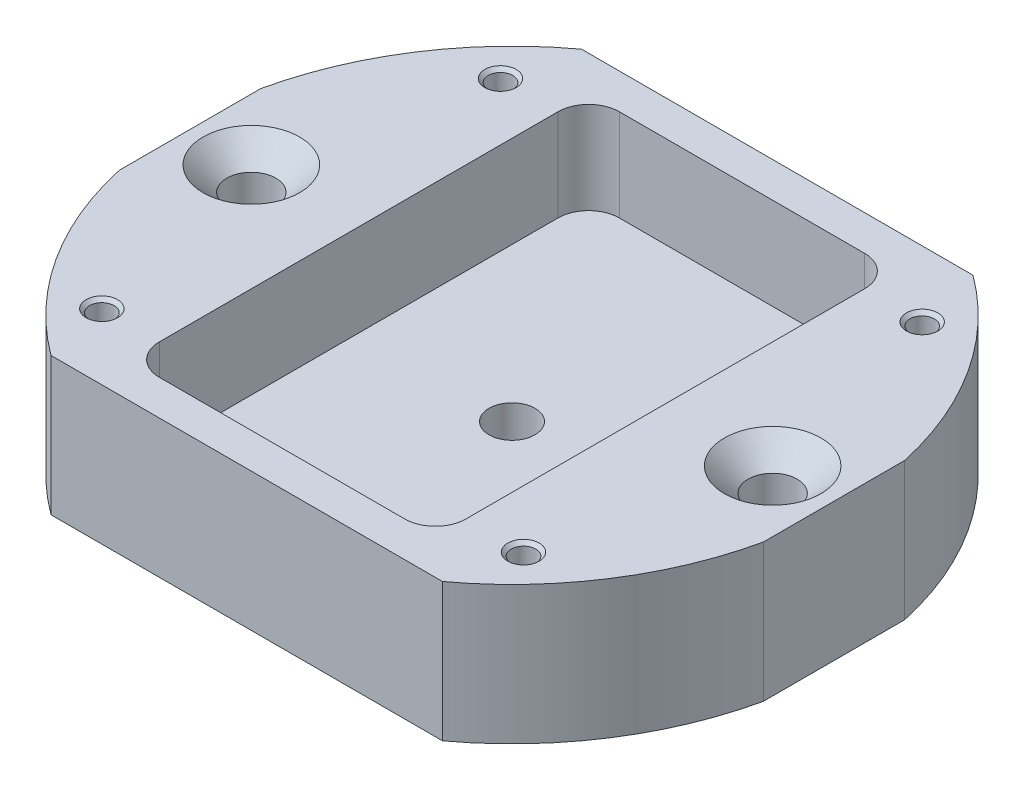
ISO-10303-21;
HEADER;
FILE_DESCRIPTION(('STEP AP214'),'2;1');
FILE_NAME('part.step','',(''),(''),'','','');
FILE_SCHEMA(('AUTOMOTIVE_DESIGN { 1 0 10303 214 1 1 1 1 }'));
ENDSEC;
DATA;
#1=APPLICATION_CONTEXT('core data for automotive mechanical design processes');
#2=APPLICATION_PROTOCOL_DEFINITION('international standard','automotive_design',2000,#1);
#3=PRODUCT_CONTEXT('',#1,'mechanical');
#4=PRODUCT('Part','Part','',(#3));
#5=PRODUCT_RELATED_PRODUCT_CATEGORY('part','',(#4));
#6=PRODUCT_DEFINITION_FORMATION('','',#4);
#7=PRODUCT_DEFINITION_CONTEXT('part definition',#1,'design');
#8=PRODUCT_DEFINITION('design','',#6,#7);
#9=PRODUCT_DEFINITION_SHAPE('','',#8);
#10=(LENGTH_UNIT() NAMED_UNIT(*) SI_UNIT(.MILLI.,.METRE.));
#11=(NAMED_UNIT(*) PLANE_ANGLE_UNIT() SI_UNIT($,.RADIAN.));
#12=(NAMED_UNIT(*) SI_UNIT($,.STERADIAN.) SOLID_ANGLE_UNIT());
#13=UNCERTAINTY_MEASURE_WITH_UNIT(LENGTH_MEASURE(1.E-05),#10,'distance_accuracy_value','');
#14=(GEOMETRIC_REPRESENTATION_CONTEXT(3) GLOBAL_UNCERTAINTY_ASSIGNED_CONTEXT((#13)) GLOBAL_UNIT_ASSIGNED_CONTEXT((#10,
#11,#12)) REPRESENTATION_CONTEXT('',''));
#15=CARTESIAN_POINT('',(0.,0.,0.));
#16=DIRECTION('',(0.,0.,1.));
#17=DIRECTION('',(1.,0.,0.));
#18=AXIS2_PLACEMENT_3D('',#15,#16,#17);
#19=CARTESIAN_POINT('',(0.,9.,0.));
#20=DIRECTION('',(0.,1.,0.));
#21=DIRECTION('',(0.,0.,1.));
#22=AXIS2_PLACEMENT_3D('',#19,#20,#21);
#23=PLANE('',#22);
#24=CARTESIAN_POINT('',(-13.75,9.,-13.));
#25=DIRECTION('',(0.,1.,0.));
#26=DIRECTION('',(0.,0.,1.));
#27=AXIS2_PLACEMENT_3D('',#24,#25,#26);
#28=CIRCLE('',#27,1.025);
#29=CARTESIAN_POINT('',(-13.75,9.,-11.975));
#30=VERTEX_POINT('',#29);
#31=EDGE_CURVE('E340',#30,#30,#28,.T.);
#32=ORIENTED_EDGE('',*,*,#31,.F.);
#33=EDGE_LOOP('',(#32));
#34=FACE_BOUND('',#33,.T.);
#35=CARTESIAN_POINT('',(13.75,9.,-13.));
#36=DIRECTION('',(0.,1.,0.));
#37=DIRECTION('',(0.,0.,1.));
#38=AXIS2_PLACEMENT_3D('',#35,#36,#37);
#39=CIRCLE('',#38,1.025);
#40=CARTESIAN_POINT('',(13.75,9.,-11.975));
#41=VERTEX_POINT('',#40);
#42=EDGE_CURVE('E349',#41,#41,#39,.T.);
#43=ORIENTED_EDGE('',*,*,#42,.F.);
#44=EDGE_LOOP('',(#43));
#45=FACE_BOUND('',#44,.T.);
#46=CARTESIAN_POINT('',(13.75,9.,13.));
#47=DIRECTION('',(0.,1.,0.));
#48=DIRECTION('',(0.,0.,1.));
#49=AXIS2_PLACEMENT_3D('',#46,#47,#48);
#50=CIRCLE('',#49,1.025);
#51=CARTESIAN_POINT('',(13.75,9.,14.025));
#52=VERTEX_POINT('',#51);
#53=EDGE_CURVE('E358',#52,#52,#50,.T.);
#54=ORIENTED_EDGE('',*,*,#53,.F.);
#55=EDGE_LOOP('',(#54));
#56=FACE_BOUND('',#55,.T.);
#57=CARTESIAN_POINT('',(-13.75,9.,13.));
#58=DIRECTION('',(0.,1.,0.));
#59=DIRECTION('',(0.,0.,1.));
#60=AXIS2_PLACEMENT_3D('',#57,#58,#59);
#61=CIRCLE('',#60,1.025);
#62=CARTESIAN_POINT('',(-13.75,9.,14.025));
#63=VERTEX_POINT('',#62);
#64=EDGE_CURVE('E367',#63,#63,#61,.T.);
#65=ORIENTED_EDGE('',*,*,#64,.F.);
#66=EDGE_LOOP('',(#65));
#67=FACE_BOUND('',#66,.T.);
#68=DIRECTION('',(0.,0.,1.));
#69=VECTOR('',#68,1.);
#70=CARTESIAN_POINT('',(-10.,9.,-15.));
#71=LINE('',#70,#69);
#72=CARTESIAN_POINT('',(-10.,9.,-13.));
#73=VERTEX_POINT('',#72);
#74=CARTESIAN_POINT('',(-10.,9.,13.));
#75=VERTEX_POINT('',#74);
#76=EDGE_CURVE('E251',#73,#75,#71,.T.);
#77=ORIENTED_EDGE('',*,*,#76,.F.);
#78=CARTESIAN_POINT('',(-8.,9.,-13.));
#79=DIRECTION('',(0.,1.,0.));
#80=DIRECTION('',(0.,0.,1.));
#81=AXIS2_PLACEMENT_3D('',#78,#79,#80);
#82=CIRCLE('',#81,2.);
#83=CARTESIAN_POINT('',(-8.,9.,-15.));
#84=VERTEX_POINT('',#83);
#85=EDGE_CURVE('E180',#73,#84,#82,.F.);
#86=ORIENTED_EDGE('',*,*,#85,.T.);
#87=DIRECTION('',(-1.,0.,0.));
#88=VECTOR('',#87,1.);
#89=CARTESIAN_POINT('',(-10.,9.,-15.));
#90=LINE('',#89,#88);
#91=CARTESIAN_POINT('',(8.,9.,-15.));
#92=VERTEX_POINT('',#91);
#93=EDGE_CURVE('E249',#92,#84,#90,.T.);
#94=ORIENTED_EDGE('',*,*,#93,.F.);
#95=CARTESIAN_POINT('',(8.,9.,-13.));
#96=DIRECTION('',(0.,1.,0.));
#97=DIRECTION('',(0.,0.,1.));
#98=AXIS2_PLACEMENT_3D('',#95,#96,#97);
#99=CIRCLE('',#98,2.);
#100=CARTESIAN_POINT('',(10.,9.,-13.));
#101=VERTEX_POINT('',#100);
#102=EDGE_CURVE('E241',#92,#101,#99,.F.);
#103=ORIENTED_EDGE('',*,*,#102,.T.);
#104=DIRECTION('',(0.,0.,-1.));
#105=VECTOR('',#104,1.);
#106=CARTESIAN_POINT('',(10.,9.,-15.));
#107=LINE('',#106,#105);
#108=CARTESIAN_POINT('',(10.,9.,13.));
#109=VERTEX_POINT('',#108);
#110=EDGE_CURVE('E261',#109,#101,#107,.T.);
#111=ORIENTED_EDGE('',*,*,#110,.F.);
#112=CARTESIAN_POINT('',(8.,9.,13.));
#113=DIRECTION('',(0.,1.,0.));
#114=DIRECTION('',(0.,0.,1.));
#115=AXIS2_PLACEMENT_3D('',#112,#113,#114);
#116=CIRCLE('',#115,2.);
#117=CARTESIAN_POINT('',(8.,9.,15.));
#118=VERTEX_POINT('',#117);
#119=EDGE_CURVE('E243',#109,#118,#116,.F.);
#120=ORIENTED_EDGE('',*,*,#119,.T.);
#121=DIRECTION('',(1.,0.,0.));
#122=VECTOR('',#121,1.);
#123=CARTESIAN_POINT('',(-10.,9.,15.));
#124=LINE('',#123,#122);
#125=CARTESIAN_POINT('',(-8.,9.,15.));
#126=VERTEX_POINT('',#125);
#127=EDGE_CURVE('E287',#126,#118,#124,.T.);
#128=ORIENTED_EDGE('',*,*,#127,.F.);
#129=CARTESIAN_POINT('',(-8.,9.,13.));
#130=DIRECTION('',(0.,1.,0.));
#131=DIRECTION('',(0.,0.,1.));
#132=AXIS2_PLACEMENT_3D('',#129,#130,#131);
#133=CIRCLE('',#132,2.);
#134=EDGE_CURVE('E239',#126,#75,#133,.F.);
#135=ORIENTED_EDGE('',*,*,#134,.T.);
#136=EDGE_LOOP('',(#77,#86,#94,#103,#111,#120,#128,#135));
#137=FACE_BOUND('',#136,.T.);
#138=CARTESIAN_POINT('',(-17.,9.,0.));
#139=DIRECTION('',(0.,1.,0.));
#140=DIRECTION('',(0.,0.,1.));
#141=AXIS2_PLACEMENT_3D('',#138,#139,#140);
#142=CIRCLE('',#141,3.15);
#143=CARTESIAN_POINT('',(-17.,9.,3.15));
#144=VERTEX_POINT('',#143);
#145=EDGE_CURVE('E285',#144,#144,#142,.T.);
#146=ORIENTED_EDGE('',*,*,#145,.F.);
#147=EDGE_LOOP('',(#146));
#148=FACE_BOUND('',#147,.T.);
#149=CARTESIAN_POINT('',(17.,9.,0.));
#150=DIRECTION('',(0.,1.,0.));
#151=DIRECTION('',(0.,0.,1.));
#152=AXIS2_PLACEMENT_3D('',#149,#150,#151);
#153=CIRCLE('',#152,3.15);
#154=CARTESIAN_POINT('',(17.,9.,3.15));
#155=VERTEX_POINT('',#154);
#156=EDGE_CURVE('E208',#155,#155,#153,.T.);
#157=ORIENTED_EDGE('',*,*,#156,.F.);
#158=EDGE_LOOP('',(#157));
#159=FACE_BOUND('',#158,.T.);
#160=CARTESIAN_POINT('',(0.,9.,0.));
#161=DIRECTION('',(0.,1.,0.));
#162=DIRECTION('',(0.,0.,1.));
#163=AXIS2_PLACEMENT_3D('',#160,#161,#162);
#164=CIRCLE('',#163,21.5);
#165=CARTESIAN_POINT('',(-12.7655787177864,9.,17.3));
#166=VERTEX_POINT('',#165);
#167=CARTESIAN_POINT('',(-21.,9.,4.60977222864643));
#168=VERTEX_POINT('',#167);
#169=EDGE_CURVE('E327',#166,#168,#164,.F.);
#170=ORIENTED_EDGE('',*,*,#169,.F.);
#171=DIRECTION('',(1.,0.,0.));
#172=VECTOR('',#171,1.);
#173=CARTESIAN_POINT('',(-21.,9.,17.3));
#174=LINE('',#173,#172);
#175=CARTESIAN_POINT('',(12.7655787177864,9.,17.3));
#176=VERTEX_POINT('',#175);
#177=EDGE_CURVE('E302',#166,#176,#174,.T.);
#178=ORIENTED_EDGE('',*,*,#177,.T.);
#179=CARTESIAN_POINT('',(21.,9.,4.60977222864643));
#180=VERTEX_POINT('',#179);
#181=EDGE_CURVE('E477',#180,#176,#164,.F.);
#182=ORIENTED_EDGE('',*,*,#181,.F.);
#183=DIRECTION('',(0.,0.,-1.));
#184=VECTOR('',#183,1.);
#185=CARTESIAN_POINT('',(21.,9.,-17.3));
#186=LINE('',#185,#184);
#187=CARTESIAN_POINT('',(21.,9.,-4.60977222864643));
#188=VERTEX_POINT('',#187);
#189=EDGE_CURVE('E187',#180,#188,#186,.T.);
#190=ORIENTED_EDGE('',*,*,#189,.T.);
#191=CARTESIAN_POINT('',(12.7655787177864,9.,-17.3));
#192=VERTEX_POINT('',#191);
#193=EDGE_CURVE('E330',#192,#188,#164,.F.);
#194=ORIENTED_EDGE('',*,*,#193,.F.);
#195=DIRECTION('',(-1.,0.,0.));
#196=VECTOR('',#195,1.);
#197=CARTESIAN_POINT('',(-21.,9.,-17.3));
#198=LINE('',#197,#196);
#199=CARTESIAN_POINT('',(-12.7655787177864,9.,-17.3));
#200=VERTEX_POINT('',#199);
#201=EDGE_CURVE('E213',#192,#200,#198,.T.);
#202=ORIENTED_EDGE('',*,*,#201,.T.);
#203=CARTESIAN_POINT('',(-21.,9.,-4.60977222864643));
#204=VERTEX_POINT('',#203);
#205=EDGE_CURVE('E325',#204,#200,#164,.F.);
#206=ORIENTED_EDGE('',*,*,#205,.F.);
#207=DIRECTION('',(0.,0.,1.));
#208=VECTOR('',#207,1.);
#209=CARTESIAN_POINT('',(-21.,9.,-17.3));
#210=LINE('',#209,#208);
#211=EDGE_CURVE('E195',#204,#168,#210,.T.);
#212=ORIENTED_EDGE('',*,*,#211,.T.);
#213=EDGE_LOOP('',(#170,#178,#182,#190,#194,#202,#206,#212));
#214=FACE_BOUND('',#213,.T.);
#215=ADVANCED_FACE('F48',(#34,#45,#56,#67,#137,#148,#159,#214),#23,.T.);
#216=CARTESIAN_POINT('',(0.,0.,0.));
#217=DIRECTION('',(0.,1.,0.));
#218=DIRECTION('',(0.,0.,1.));
#219=AXIS2_PLACEMENT_3D('',#216,#217,#218);
#220=PLANE('',#219);
#221=CARTESIAN_POINT('',(0.,0.,0.));
#222=DIRECTION('',(0.,1.,0.));
#223=DIRECTION('',(0.,0.,1.));
#224=AXIS2_PLACEMENT_3D('',#221,#222,#223);
#225=CIRCLE('',#224,1.5);
#226=CARTESIAN_POINT('',(0.,0.,1.5));
#227=VERTEX_POINT('',#226);
#228=EDGE_CURVE('E337',#227,#227,#225,.T.);
#229=ORIENTED_EDGE('',*,*,#228,.T.);
#230=EDGE_LOOP('',(#229));
#231=FACE_BOUND('',#230,.T.);
#232=CARTESIAN_POINT('',(-17.,0.,0.));
#233=DIRECTION('',(0.,1.,0.));
#234=DIRECTION('',(0.,0.,1.));
#235=AXIS2_PLACEMENT_3D('',#232,#233,#234);
#236=CIRCLE('',#235,1.6);
#237=CARTESIAN_POINT('',(-17.,0.,1.6));
#238=VERTEX_POINT('',#237);
#239=EDGE_CURVE('E205',#238,#238,#236,.T.);
#240=ORIENTED_EDGE('',*,*,#239,.T.);
#241=EDGE_LOOP('',(#240));
#242=FACE_BOUND('',#241,.T.);
#243=CARTESIAN_POINT('',(17.,0.,0.));
#244=DIRECTION('',(0.,1.,0.));
#245=DIRECTION('',(0.,0.,1.));
#246=AXIS2_PLACEMENT_3D('',#243,#244,#245);
#247=CIRCLE('',#246,1.6);
#248=CARTESIAN_POINT('',(17.,0.,1.59999999999999));
#249=VERTEX_POINT('',#248);
#250=EDGE_CURVE('E201',#249,#249,#247,.T.);
#251=ORIENTED_EDGE('',*,*,#250,.T.);
#252=EDGE_LOOP('',(#251));
#253=FACE_BOUND('',#252,.T.);
#254=DIRECTION('',(1.,0.,0.));
#255=VECTOR('',#254,1.);
#256=CARTESIAN_POINT('',(-21.,0.,17.3));
#257=LINE('',#256,#255);
#258=CARTESIAN_POINT('',(-12.7655787177864,0.,17.3));
#259=VERTEX_POINT('',#258);
#260=CARTESIAN_POINT('',(12.7655787177864,0.,17.3));
#261=VERTEX_POINT('',#260);
#262=EDGE_CURVE('E192',#259,#261,#257,.T.);
#263=ORIENTED_EDGE('',*,*,#262,.F.);
#264=CARTESIAN_POINT('',(0.,0.,0.));
#265=DIRECTION('',(0.,1.,0.));
#266=DIRECTION('',(0.,0.,1.));
#267=AXIS2_PLACEMENT_3D('',#264,#265,#266);
#268=CIRCLE('',#267,21.5);
#269=CARTESIAN_POINT('',(-21.,0.,4.60977222864643));
#270=VERTEX_POINT('',#269);
#271=EDGE_CURVE('E12',#259,#270,#268,.F.);
#272=ORIENTED_EDGE('',*,*,#271,.T.);
#273=DIRECTION('',(0.,0.,1.));
#274=VECTOR('',#273,1.);
#275=CARTESIAN_POINT('',(-21.,0.,-17.3));
#276=LINE('',#275,#274);
#277=CARTESIAN_POINT('',(-21.,0.,-4.60977222864643));
#278=VERTEX_POINT('',#277);
#279=EDGE_CURVE('E197',#278,#270,#276,.T.);
#280=ORIENTED_EDGE('',*,*,#279,.F.);
#281=CARTESIAN_POINT('',(-12.7655787177864,0.,-17.3));
#282=VERTEX_POINT('',#281);
#283=EDGE_CURVE('E57',#278,#282,#268,.F.);
#284=ORIENTED_EDGE('',*,*,#283,.T.);
#285=DIRECTION('',(-1.,0.,0.));
#286=VECTOR('',#285,1.);
#287=CARTESIAN_POINT('',(-21.,0.,-17.3));
#288=LINE('',#287,#286);
#289=CARTESIAN_POINT('',(12.7655787177864,0.,-17.3));
#290=VERTEX_POINT('',#289);
#291=EDGE_CURVE('E191',#290,#282,#288,.T.);
#292=ORIENTED_EDGE('',*,*,#291,.F.);
#293=CARTESIAN_POINT('',(21.,0.,-4.60977222864643));
#294=VERTEX_POINT('',#293);
#295=EDGE_CURVE('E179',#290,#294,#268,.F.);
#296=ORIENTED_EDGE('',*,*,#295,.T.);
#297=DIRECTION('',(0.,0.,-1.));
#298=VECTOR('',#297,1.);
#299=CARTESIAN_POINT('',(21.,0.,-17.3));
#300=LINE('',#299,#298);
#301=CARTESIAN_POINT('',(21.,0.,4.60977222864643));
#302=VERTEX_POINT('',#301);
#303=EDGE_CURVE('E185',#302,#294,#300,.T.);
#304=ORIENTED_EDGE('',*,*,#303,.F.);
#305=EDGE_CURVE('E52',#302,#261,#268,.F.);
#306=ORIENTED_EDGE('',*,*,#305,.T.);
#307=EDGE_LOOP('',(#263,#272,#280,#284,#292,#296,#304,#306));
#308=FACE_BOUND('',#307,.T.);
#309=ADVANCED_FACE('F189',(#231,#242,#253,#308),#220,.F.);
#310=CARTESIAN_POINT('',(-21.,9.,-17.3));
#311=DIRECTION('',(1.,0.,0.));
#312=DIRECTION('',(0.,0.,-1.));
#313=AXIS2_PLACEMENT_3D('',#310,#311,#312);
#314=PLANE('',#313);
#315=ORIENTED_EDGE('',*,*,#211,.F.);
#316=DIRECTION('',(0.,1.,0.));
#317=VECTOR('',#316,1.);
#318=CARTESIAN_POINT('',(-21.,-10.,-4.60977222864643));
#319=LINE('',#318,#317);
#320=EDGE_CURVE('E315',#204,#278,#319,.F.);
#321=ORIENTED_EDGE('',*,*,#320,.T.);
#322=ORIENTED_EDGE('',*,*,#279,.T.);
#323=DIRECTION('',(0.,1.,0.));
#324=VECTOR('',#323,1.);
#325=CARTESIAN_POINT('',(-21.,-10.,4.60977222864643));
#326=LINE('',#325,#324);
#327=EDGE_CURVE('E314',#270,#168,#326,.T.);
#328=ORIENTED_EDGE('',*,*,#327,.T.);
#329=EDGE_LOOP('',(#315,#321,#322,#328));
#330=FACE_BOUND('',#329,.T.);
#331=ADVANCED_FACE('F313',(#330),#314,.F.);
#332=CARTESIAN_POINT('',(-21.,9.,17.3));
#333=DIRECTION('',(0.,0.,-1.));
#334=DIRECTION('',(-1.,0.,0.));
#335=AXIS2_PLACEMENT_3D('',#332,#333,#334);
#336=PLANE('',#335);
#337=ORIENTED_EDGE('',*,*,#177,.F.);
#338=DIRECTION('',(0.,1.,0.));
#339=VECTOR('',#338,1.);
#340=CARTESIAN_POINT('',(-12.7655787177864,-10.,17.3));
#341=LINE('',#340,#339);
#342=EDGE_CURVE('E320',#166,#259,#341,.F.);
#343=ORIENTED_EDGE('',*,*,#342,.T.);
#344=ORIENTED_EDGE('',*,*,#262,.T.);
#345=DIRECTION('',(0.,1.,0.));
#346=VECTOR('',#345,1.);
#347=CARTESIAN_POINT('',(12.7655787177864,-10.,17.3));
#348=LINE('',#347,#346);
#349=EDGE_CURVE('E64',#261,#176,#348,.T.);
#350=ORIENTED_EDGE('',*,*,#349,.T.);
#351=EDGE_LOOP('',(#337,#343,#344,#350));
#352=FACE_BOUND('',#351,.T.);
#353=ADVANCED_FACE('F324',(#352),#336,.F.);
#354=CARTESIAN_POINT('',(21.,9.,-17.3));
#355=DIRECTION('',(-1.,0.,0.));
#356=DIRECTION('',(0.,0.,1.));
#357=AXIS2_PLACEMENT_3D('',#354,#355,#356);
#358=PLANE('',#357);
#359=ORIENTED_EDGE('',*,*,#189,.F.);
#360=DIRECTION('',(0.,1.,0.));
#361=VECTOR('',#360,1.);
#362=CARTESIAN_POINT('',(21.,-10.,4.60977222864643));
#363=LINE('',#362,#361);
#364=EDGE_CURVE('E173',#180,#302,#363,.F.);
#365=ORIENTED_EDGE('',*,*,#364,.T.);
#366=ORIENTED_EDGE('',*,*,#303,.T.);
#367=DIRECTION('',(0.,1.,0.));
#368=VECTOR('',#367,1.);
#369=CARTESIAN_POINT('',(21.,-10.,-4.60977222864643));
#370=LINE('',#369,#368);
#371=EDGE_CURVE('E72',#294,#188,#370,.T.);
#372=ORIENTED_EDGE('',*,*,#371,.T.);
#373=EDGE_LOOP('',(#359,#365,#366,#372));
#374=FACE_BOUND('',#373,.T.);
#375=ADVANCED_FACE('F184',(#374),#358,.F.);
#376=CARTESIAN_POINT('',(-21.,9.,-17.3));
#377=DIRECTION('',(0.,0.,1.));
#378=DIRECTION('',(1.,0.,0.));
#379=AXIS2_PLACEMENT_3D('',#376,#377,#378);
#380=PLANE('',#379);
#381=ORIENTED_EDGE('',*,*,#201,.F.);
#382=DIRECTION('',(0.,1.,0.));
#383=VECTOR('',#382,1.);
#384=CARTESIAN_POINT('',(12.7655787177864,-10.,-17.3));
#385=LINE('',#384,#383);
#386=EDGE_CURVE('E480',#192,#290,#385,.F.);
#387=ORIENTED_EDGE('',*,*,#386,.T.);
#388=ORIENTED_EDGE('',*,*,#291,.T.);
#389=DIRECTION('',(0.,1.,0.));
#390=VECTOR('',#389,1.);
#391=CARTESIAN_POINT('',(-12.7655787177864,-10.,-17.3));
#392=LINE('',#391,#390);
#393=EDGE_CURVE('E482',#282,#200,#392,.T.);
#394=ORIENTED_EDGE('',*,*,#393,.T.);
#395=EDGE_LOOP('',(#381,#387,#388,#394));
#396=FACE_BOUND('',#395,.T.);
#397=ADVANCED_FACE('F405',(#396),#380,.F.);
#398=CARTESIAN_POINT('',(17.,9.,0.));
#399=DIRECTION('',(0.,1.,0.));
#400=DIRECTION('',(0.,0.,1.));
#401=AXIS2_PLACEMENT_3D('',#398,#399,#400);
#402=CYLINDRICAL_SURFACE('',#401,1.6);
#403=CARTESIAN_POINT('',(17.,7.45,0.));
#404=DIRECTION('',(0.,1.,0.));
#405=DIRECTION('',(0.,0.,1.));
#406=AXIS2_PLACEMENT_3D('',#403,#404,#405);
#407=CIRCLE('',#406,1.6);
#408=CARTESIAN_POINT('',(17.,7.45,1.59999999999999));
#409=VERTEX_POINT('',#408);
#410=EDGE_CURVE('E204',#409,#409,#407,.T.);
#411=ORIENTED_EDGE('',*,*,#410,.T.);
#412=EDGE_LOOP('',(#411));
#413=FACE_BOUND('',#412,.T.);
#414=ORIENTED_EDGE('',*,*,#250,.F.);
#415=EDGE_LOOP('',(#414));
#416=FACE_BOUND('',#415,.T.);
#417=ADVANCED_FACE('F402',(#413,#416),#402,.F.);
#418=CARTESIAN_POINT('',(17.,9.,0.));
#419=DIRECTION('',(0.,1.,0.));
#420=DIRECTION('',(0.,0.,1.));
#421=AXIS2_PLACEMENT_3D('',#418,#419,#420);
#422=CONICAL_SURFACE('',#421,3.15,0.785398163397449);
#423=ORIENTED_EDGE('',*,*,#410,.F.);
#424=EDGE_LOOP('',(#423));
#425=FACE_BOUND('',#424,.T.);
#426=ORIENTED_EDGE('',*,*,#156,.T.);
#427=EDGE_LOOP('',(#426));
#428=FACE_BOUND('',#427,.T.);
#429=ADVANCED_FACE('F463',(#425,#428),#422,.F.);
#430=CARTESIAN_POINT('',(-17.,9.,0.));
#431=DIRECTION('',(0.,1.,0.));
#432=DIRECTION('',(0.,0.,1.));
#433=AXIS2_PLACEMENT_3D('',#430,#431,#432);
#434=CYLINDRICAL_SURFACE('',#433,1.6);
#435=CARTESIAN_POINT('',(-17.,7.45,0.));
#436=DIRECTION('',(0.,1.,0.));
#437=DIRECTION('',(0.,0.,1.));
#438=AXIS2_PLACEMENT_3D('',#435,#436,#437);
#439=CIRCLE('',#438,1.6);
#440=CARTESIAN_POINT('',(-17.,7.45,1.6));
#441=VERTEX_POINT('',#440);
#442=EDGE_CURVE('E209',#441,#441,#439,.T.);
#443=ORIENTED_EDGE('',*,*,#442,.T.);
#444=EDGE_LOOP('',(#443));
#445=FACE_BOUND('',#444,.T.);
#446=ORIENTED_EDGE('',*,*,#239,.F.);
#447=EDGE_LOOP('',(#446));
#448=FACE_BOUND('',#447,.T.);
#449=ADVANCED_FACE('F460',(#445,#448),#434,.F.);
#450=CARTESIAN_POINT('',(-17.,9.,0.));
#451=DIRECTION('',(0.,1.,0.));
#452=DIRECTION('',(0.,0.,1.));
#453=AXIS2_PLACEMENT_3D('',#450,#451,#452);
#454=CONICAL_SURFACE('',#453,3.15,0.785398163397448);
#455=ORIENTED_EDGE('',*,*,#442,.F.);
#456=EDGE_LOOP('',(#455));
#457=FACE_BOUND('',#456,.T.);
#458=ORIENTED_EDGE('',*,*,#145,.T.);
#459=EDGE_LOOP('',(#458));
#460=FACE_BOUND('',#459,.T.);
#461=ADVANCED_FACE('F457',(#457,#460),#454,.F.);
#462=CARTESIAN_POINT('',(-10.,3.,-15.));
#463=DIRECTION('',(-1.,0.,0.));
#464=DIRECTION('',(0.,0.,1.));
#465=AXIS2_PLACEMENT_3D('',#462,#463,#464);
#466=PLANE('',#465);
#467=ORIENTED_EDGE('',*,*,#76,.T.);
#468=DIRECTION('',(0.,1.,0.));
#469=VECTOR('',#468,1.);
#470=CARTESIAN_POINT('',(-10.,3.,13.));
#471=LINE('',#470,#469);
#472=CARTESIAN_POINT('',(-10.,3.,13.));
#473=VERTEX_POINT('',#472);
#474=EDGE_CURVE('E219',#75,#473,#471,.F.);
#475=ORIENTED_EDGE('',*,*,#474,.T.);
#476=DIRECTION('',(0.,0.,1.));
#477=VECTOR('',#476,1.);
#478=CARTESIAN_POINT('',(-10.,3.,-15.));
#479=LINE('',#478,#477);
#480=CARTESIAN_POINT('',(-10.,3.,-13.));
#481=VERTEX_POINT('',#480);
#482=EDGE_CURVE('E260',#481,#473,#479,.T.);
#483=ORIENTED_EDGE('',*,*,#482,.F.);
#484=DIRECTION('',(0.,1.,0.));
#485=VECTOR('',#484,1.);
#486=CARTESIAN_POINT('',(-10.,9.,-13.));
#487=LINE('',#486,#485);
#488=EDGE_CURVE('E216',#481,#73,#487,.T.);
#489=ORIENTED_EDGE('',*,*,#488,.T.);
#490=EDGE_LOOP('',(#467,#475,#483,#489));
#491=FACE_BOUND('',#490,.T.);
#492=ADVANCED_FACE('F271',(#491),#466,.F.);
#493=CARTESIAN_POINT('',(-10.,3.,-15.));
#494=DIRECTION('',(0.,0.,-1.));
#495=DIRECTION('',(-1.,0.,0.));
#496=AXIS2_PLACEMENT_3D('',#493,#494,#495);
#497=PLANE('',#496);
#498=DIRECTION('',(-1.,0.,0.));
#499=VECTOR('',#498,1.);
#500=CARTESIAN_POINT('',(-10.,3.,-15.));
#501=LINE('',#500,#499);
#502=CARTESIAN_POINT('',(8.,3.,-15.));
#503=VERTEX_POINT('',#502);
#504=CARTESIAN_POINT('',(-8.,3.,-15.));
#505=VERTEX_POINT('',#504);
#506=EDGE_CURVE('E269',#503,#505,#501,.T.);
#507=ORIENTED_EDGE('',*,*,#506,.F.);
#508=DIRECTION('',(0.,1.,0.));
#509=VECTOR('',#508,1.);
#510=CARTESIAN_POINT('',(8.,9.,-15.));
#511=LINE('',#510,#509);
#512=EDGE_CURVE('E231',#503,#92,#511,.T.);
#513=ORIENTED_EDGE('',*,*,#512,.T.);
#514=ORIENTED_EDGE('',*,*,#93,.T.);
#515=DIRECTION('',(0.,1.,0.));
#516=VECTOR('',#515,1.);
#517=CARTESIAN_POINT('',(-8.,3.,-15.));
#518=LINE('',#517,#516);
#519=EDGE_CURVE('E229',#84,#505,#518,.F.);
#520=ORIENTED_EDGE('',*,*,#519,.T.);
#521=EDGE_LOOP('',(#507,#513,#514,#520));
#522=FACE_BOUND('',#521,.T.);
#523=ADVANCED_FACE('F257',(#522),#497,.F.);
#524=CARTESIAN_POINT('',(10.,3.,-15.));
#525=DIRECTION('',(1.,0.,0.));
#526=DIRECTION('',(0.,0.,-1.));
#527=AXIS2_PLACEMENT_3D('',#524,#525,#526);
#528=PLANE('',#527);
#529=ORIENTED_EDGE('',*,*,#110,.T.);
#530=DIRECTION('',(0.,1.,0.));
#531=VECTOR('',#530,1.);
#532=CARTESIAN_POINT('',(10.,3.,-13.));
#533=LINE('',#532,#531);
#534=CARTESIAN_POINT('',(10.,3.,-13.));
#535=VERTEX_POINT('',#534);
#536=EDGE_CURVE('E237',#101,#535,#533,.F.);
#537=ORIENTED_EDGE('',*,*,#536,.T.);
#538=DIRECTION('',(0.,0.,-1.));
#539=VECTOR('',#538,1.);
#540=CARTESIAN_POINT('',(10.,3.,-15.));
#541=LINE('',#540,#539);
#542=CARTESIAN_POINT('',(10.,3.,13.));
#543=VERTEX_POINT('',#542);
#544=EDGE_CURVE('E276',#543,#535,#541,.T.);
#545=ORIENTED_EDGE('',*,*,#544,.F.);
#546=DIRECTION('',(0.,1.,0.));
#547=VECTOR('',#546,1.);
#548=CARTESIAN_POINT('',(10.,9.,13.));
#549=LINE('',#548,#547);
#550=EDGE_CURVE('E234',#543,#109,#549,.T.);
#551=ORIENTED_EDGE('',*,*,#550,.T.);
#552=EDGE_LOOP('',(#529,#537,#545,#551));
#553=FACE_BOUND('',#552,.T.);
#554=ADVANCED_FACE('F437',(#553),#528,.F.);
#555=CARTESIAN_POINT('',(-10.,3.,15.));
#556=DIRECTION('',(0.,0.,1.));
#557=DIRECTION('',(1.,0.,0.));
#558=AXIS2_PLACEMENT_3D('',#555,#556,#557);
#559=PLANE('',#558);
#560=DIRECTION('',(1.,0.,0.));
#561=VECTOR('',#560,1.);
#562=CARTESIAN_POINT('',(-10.,3.,15.));
#563=LINE('',#562,#561);
#564=CARTESIAN_POINT('',(-8.,3.,15.));
#565=VERTEX_POINT('',#564);
#566=CARTESIAN_POINT('',(8.,3.,15.));
#567=VERTEX_POINT('',#566);
#568=EDGE_CURVE('E273',#565,#567,#563,.T.);
#569=ORIENTED_EDGE('',*,*,#568,.F.);
#570=DIRECTION('',(0.,1.,0.));
#571=VECTOR('',#570,1.);
#572=CARTESIAN_POINT('',(-8.,9.,15.));
#573=LINE('',#572,#571);
#574=EDGE_CURVE('E212',#565,#126,#573,.T.);
#575=ORIENTED_EDGE('',*,*,#574,.T.);
#576=ORIENTED_EDGE('',*,*,#127,.T.);
#577=DIRECTION('',(0.,1.,0.));
#578=VECTOR('',#577,1.);
#579=CARTESIAN_POINT('',(8.,3.,15.));
#580=LINE('',#579,#578);
#581=EDGE_CURVE('E210',#118,#567,#580,.F.);
#582=ORIENTED_EDGE('',*,*,#581,.T.);
#583=EDGE_LOOP('',(#569,#575,#576,#582));
#584=FACE_BOUND('',#583,.T.);
#585=ADVANCED_FACE('F442',(#584),#559,.F.);
#586=CARTESIAN_POINT('',(0.,3.,0.));
#587=DIRECTION('',(0.,1.,0.));
#588=DIRECTION('',(0.,0.,1.));
#589=AXIS2_PLACEMENT_3D('',#586,#587,#588);
#590=PLANE('',#589);
#591=CARTESIAN_POINT('',(0.,3.,0.));
#592=DIRECTION('',(0.,1.,0.));
#593=DIRECTION('',(0.,0.,1.));
#594=AXIS2_PLACEMENT_3D('',#591,#592,#593);
#595=CIRCLE('',#594,1.49999999999999);
#596=CARTESIAN_POINT('',(0.,3.,1.49999999999999));
#597=VERTEX_POINT('',#596);
#598=EDGE_CURVE('E334',#597,#597,#595,.T.);
#599=ORIENTED_EDGE('',*,*,#598,.F.);
#600=EDGE_LOOP('',(#599));
#601=FACE_BOUND('',#600,.T.);
#602=ORIENTED_EDGE('',*,*,#482,.T.);
#603=CARTESIAN_POINT('',(-8.,3.,13.));
#604=DIRECTION('',(0.,1.,0.));
#605=DIRECTION('',(0.,0.,1.));
#606=AXIS2_PLACEMENT_3D('',#603,#604,#605);
#607=CIRCLE('',#606,2.);
#608=EDGE_CURVE('E227',#473,#565,#607,.T.);
#609=ORIENTED_EDGE('',*,*,#608,.T.);
#610=ORIENTED_EDGE('',*,*,#568,.T.);
#611=CARTESIAN_POINT('',(8.,3.,13.));
#612=DIRECTION('',(0.,1.,0.));
#613=DIRECTION('',(0.,0.,1.));
#614=AXIS2_PLACEMENT_3D('',#611,#612,#613);
#615=CIRCLE('',#614,2.);
#616=EDGE_CURVE('E223',#567,#543,#615,.T.);
#617=ORIENTED_EDGE('',*,*,#616,.T.);
#618=ORIENTED_EDGE('',*,*,#544,.T.);
#619=CARTESIAN_POINT('',(8.,3.,-13.));
#620=DIRECTION('',(0.,1.,0.));
#621=DIRECTION('',(0.,0.,1.));
#622=AXIS2_PLACEMENT_3D('',#619,#620,#621);
#623=CIRCLE('',#622,2.);
#624=EDGE_CURVE('E225',#535,#503,#623,.T.);
#625=ORIENTED_EDGE('',*,*,#624,.T.);
#626=ORIENTED_EDGE('',*,*,#506,.T.);
#627=CARTESIAN_POINT('',(-8.,3.,-13.));
#628=DIRECTION('',(0.,1.,0.));
#629=DIRECTION('',(0.,0.,1.));
#630=AXIS2_PLACEMENT_3D('',#627,#628,#629);
#631=CIRCLE('',#630,2.);
#632=EDGE_CURVE('E221',#505,#481,#631,.T.);
#633=ORIENTED_EDGE('',*,*,#632,.T.);
#634=EDGE_LOOP('',(#602,#609,#610,#617,#618,#625,#626,#633));
#635=FACE_BOUND('',#634,.T.);
#636=ADVANCED_FACE('F267',(#601,#635),#590,.T.);
#637=CARTESIAN_POINT('',(-13.75,3.,13.));
#638=DIRECTION('',(0.,1.,0.));
#639=DIRECTION('',(0.,0.,1.));
#640=AXIS2_PLACEMENT_3D('',#637,#638,#639);
#641=CONICAL_SURFACE('',#640,0.799999999999997,1.02974425867665);
#642=CARTESIAN_POINT('',(-13.75,2.51931150477795,13.));
#643=VERTEX_POINT('',#642);
#644=VERTEX_LOOP('',#643);
#645=FACE_BOUND('',#644,.T.);
#646=CARTESIAN_POINT('',(-13.75,3.,13.));
#647=DIRECTION('',(0.,1.,0.));
#648=DIRECTION('',(0.,0.,1.));
#649=AXIS2_PLACEMENT_3D('',#646,#647,#648);
#650=CIRCLE('',#649,0.799999999999997);
#651=CARTESIAN_POINT('',(-13.75,3.,13.8));
#652=VERTEX_POINT('',#651);
#653=EDGE_CURVE('E279',#652,#652,#650,.T.);
#654=ORIENTED_EDGE('',*,*,#653,.T.);
#655=EDGE_LOOP('',(#654));
#656=FACE_BOUND('',#655,.T.);
#657=ADVANCED_FACE('F376',(#645,#656),#641,.F.);
#658=CARTESIAN_POINT('',(-13.75,9.,13.));
#659=DIRECTION('',(0.,1.,0.));
#660=DIRECTION('',(0.,0.,1.));
#661=AXIS2_PLACEMENT_3D('',#658,#659,#660);
#662=CYLINDRICAL_SURFACE('',#661,0.799999999999998);
#663=ORIENTED_EDGE('',*,*,#653,.F.);
#664=EDGE_LOOP('',(#663));
#665=FACE_BOUND('',#664,.T.);
#666=CARTESIAN_POINT('',(-13.75,8.775,13.));
#667=DIRECTION('',(0.,1.,0.));
#668=DIRECTION('',(0.,0.,1.));
#669=AXIS2_PLACEMENT_3D('',#666,#667,#668);
#670=CIRCLE('',#669,0.799999999999999);
#671=CARTESIAN_POINT('',(-13.75,8.775,13.8));
#672=VERTEX_POINT('',#671);
#673=EDGE_CURVE('E369',#672,#672,#670,.T.);
#674=ORIENTED_EDGE('',*,*,#673,.T.);
#675=EDGE_LOOP('',(#674));
#676=FACE_BOUND('',#675,.T.);
#677=ADVANCED_FACE('F378',(#665,#676),#662,.F.);
#678=CARTESIAN_POINT('',(-13.75,9.,13.));
#679=DIRECTION('',(0.,1.,0.));
#680=DIRECTION('',(0.,0.,1.));
#681=AXIS2_PLACEMENT_3D('',#678,#679,#680);
#682=CONICAL_SURFACE('',#681,1.025,0.785398163397452);
#683=ORIENTED_EDGE('',*,*,#673,.F.);
#684=EDGE_LOOP('',(#683));
#685=FACE_BOUND('',#684,.T.);
#686=ORIENTED_EDGE('',*,*,#64,.T.);
#687=EDGE_LOOP('',(#686));
#688=FACE_BOUND('',#687,.T.);
#689=ADVANCED_FACE('F380',(#685,#688),#682,.F.);
#690=CARTESIAN_POINT('',(13.75,3.,13.));
#691=DIRECTION('',(0.,1.,0.));
#692=DIRECTION('',(0.,0.,1.));
#693=AXIS2_PLACEMENT_3D('',#690,#691,#692);
#694=CONICAL_SURFACE('',#693,0.799999999999997,1.02974425867665);
#695=CARTESIAN_POINT('',(13.75,2.51931150477795,13.));
#696=VERTEX_POINT('',#695);
#697=VERTEX_LOOP('',#696);
#698=FACE_BOUND('',#697,.T.);
#699=CARTESIAN_POINT('',(13.75,3.,13.));
#700=DIRECTION('',(0.,1.,0.));
#701=DIRECTION('',(0.,0.,1.));
#702=AXIS2_PLACEMENT_3D('',#699,#700,#701);
#703=CIRCLE('',#702,0.799999999999997);
#704=CARTESIAN_POINT('',(13.75,3.,13.8));
#705=VERTEX_POINT('',#704);
#706=EDGE_CURVE('E364',#705,#705,#703,.T.);
#707=ORIENTED_EDGE('',*,*,#706,.T.);
#708=EDGE_LOOP('',(#707));
#709=FACE_BOUND('',#708,.T.);
#710=ADVANCED_FACE('F386',(#698,#709),#694,.F.);
#711=CARTESIAN_POINT('',(13.75,9.,13.));
#712=DIRECTION('',(0.,1.,0.));
#713=DIRECTION('',(0.,0.,1.));
#714=AXIS2_PLACEMENT_3D('',#711,#712,#713);
#715=CYLINDRICAL_SURFACE('',#714,0.799999999999998);
#716=ORIENTED_EDGE('',*,*,#706,.F.);
#717=EDGE_LOOP('',(#716));
#718=FACE_BOUND('',#717,.T.);
#719=CARTESIAN_POINT('',(13.75,8.775,13.));
#720=DIRECTION('',(0.,1.,0.));
#721=DIRECTION('',(0.,0.,1.));
#722=AXIS2_PLACEMENT_3D('',#719,#720,#721);
#723=CIRCLE('',#722,0.799999999999999);
#724=CARTESIAN_POINT('',(13.75,8.775,13.8));
#725=VERTEX_POINT('',#724);
#726=EDGE_CURVE('E361',#725,#725,#723,.T.);
#727=ORIENTED_EDGE('',*,*,#726,.T.);
#728=EDGE_LOOP('',(#727));
#729=FACE_BOUND('',#728,.T.);
#730=ADVANCED_FACE('F527',(#718,#729),#715,.F.);
#731=CARTESIAN_POINT('',(13.75,9.,13.));
#732=DIRECTION('',(0.,1.,0.));
#733=DIRECTION('',(0.,0.,1.));
#734=AXIS2_PLACEMENT_3D('',#731,#732,#733);
#735=CONICAL_SURFACE('',#734,1.025,0.785398163397452);
#736=ORIENTED_EDGE('',*,*,#726,.F.);
#737=EDGE_LOOP('',(#736));
#738=FACE_BOUND('',#737,.T.);
#739=ORIENTED_EDGE('',*,*,#53,.T.);
#740=EDGE_LOOP('',(#739));
#741=FACE_BOUND('',#740,.T.);
#742=ADVANCED_FACE('F523',(#738,#741),#735,.F.);
#743=CARTESIAN_POINT('',(13.75,3.,-13.));
#744=DIRECTION('',(0.,1.,0.));
#745=DIRECTION('',(0.,0.,1.));
#746=AXIS2_PLACEMENT_3D('',#743,#744,#745);
#747=CONICAL_SURFACE('',#746,0.799999999999997,1.02974425867665);
#748=CARTESIAN_POINT('',(13.75,2.51931150477795,-13.));
#749=VERTEX_POINT('',#748);
#750=VERTEX_LOOP('',#749);
#751=FACE_BOUND('',#750,.T.);
#752=CARTESIAN_POINT('',(13.75,3.,-13.));
#753=DIRECTION('',(0.,1.,0.));
#754=DIRECTION('',(0.,0.,1.));
#755=AXIS2_PLACEMENT_3D('',#752,#753,#754);
#756=CIRCLE('',#755,0.799999999999997);
#757=CARTESIAN_POINT('',(13.75,3.,-12.2));
#758=VERTEX_POINT('',#757);
#759=EDGE_CURVE('E355',#758,#758,#756,.T.);
#760=ORIENTED_EDGE('',*,*,#759,.T.);
#761=EDGE_LOOP('',(#760));
#762=FACE_BOUND('',#761,.T.);
#763=ADVANCED_FACE('F519',(#751,#762),#747,.F.);
#764=CARTESIAN_POINT('',(13.75,9.,-13.));
#765=DIRECTION('',(0.,1.,0.));
#766=DIRECTION('',(0.,0.,1.));
#767=AXIS2_PLACEMENT_3D('',#764,#765,#766);
#768=CYLINDRICAL_SURFACE('',#767,0.799999999999998);
#769=ORIENTED_EDGE('',*,*,#759,.F.);
#770=EDGE_LOOP('',(#769));
#771=FACE_BOUND('',#770,.T.);
#772=CARTESIAN_POINT('',(13.75,8.775,-13.));
#773=DIRECTION('',(0.,1.,0.));
#774=DIRECTION('',(0.,0.,1.));
#775=AXIS2_PLACEMENT_3D('',#772,#773,#774);
#776=CIRCLE('',#775,0.799999999999999);
#777=CARTESIAN_POINT('',(13.75,8.775,-12.2));
#778=VERTEX_POINT('',#777);
#779=EDGE_CURVE('E352',#778,#778,#776,.T.);
#780=ORIENTED_EDGE('',*,*,#779,.T.);
#781=EDGE_LOOP('',(#780));
#782=FACE_BOUND('',#781,.T.);
#783=ADVANCED_FACE('F515',(#771,#782),#768,.F.);
#784=CARTESIAN_POINT('',(13.75,9.,-13.));
#785=DIRECTION('',(0.,1.,0.));
#786=DIRECTION('',(0.,0.,1.));
#787=AXIS2_PLACEMENT_3D('',#784,#785,#786);
#788=CONICAL_SURFACE('',#787,1.025,0.785398163397452);
#789=ORIENTED_EDGE('',*,*,#779,.F.);
#790=EDGE_LOOP('',(#789));
#791=FACE_BOUND('',#790,.T.);
#792=ORIENTED_EDGE('',*,*,#42,.T.);
#793=EDGE_LOOP('',(#792));
#794=FACE_BOUND('',#793,.T.);
#795=ADVANCED_FACE('F511',(#791,#794),#788,.F.);
#796=CARTESIAN_POINT('',(-13.75,3.,-13.));
#797=DIRECTION('',(0.,1.,0.));
#798=DIRECTION('',(0.,0.,1.));
#799=AXIS2_PLACEMENT_3D('',#796,#797,#798);
#800=CONICAL_SURFACE('',#799,0.799999999999997,1.02974425867665);
#801=CARTESIAN_POINT('',(-13.75,2.51931150477795,-13.));
#802=VERTEX_POINT('',#801);
#803=VERTEX_LOOP('',#802);
#804=FACE_BOUND('',#803,.T.);
#805=CARTESIAN_POINT('',(-13.75,3.,-13.));
#806=DIRECTION('',(0.,1.,0.));
#807=DIRECTION('',(0.,0.,1.));
#808=AXIS2_PLACEMENT_3D('',#805,#806,#807);
#809=CIRCLE('',#808,0.799999999999997);
#810=CARTESIAN_POINT('',(-13.75,3.,-12.2));
#811=VERTEX_POINT('',#810);
#812=EDGE_CURVE('E346',#811,#811,#809,.T.);
#813=ORIENTED_EDGE('',*,*,#812,.T.);
#814=EDGE_LOOP('',(#813));
#815=FACE_BOUND('',#814,.T.);
#816=ADVANCED_FACE('F507',(#804,#815),#800,.F.);
#817=CARTESIAN_POINT('',(-13.75,9.,-13.));
#818=DIRECTION('',(0.,1.,0.));
#819=DIRECTION('',(0.,0.,1.));
#820=AXIS2_PLACEMENT_3D('',#817,#818,#819);
#821=CYLINDRICAL_SURFACE('',#820,0.799999999999998);
#822=ORIENTED_EDGE('',*,*,#812,.F.);
#823=EDGE_LOOP('',(#822));
#824=FACE_BOUND('',#823,.T.);
#825=CARTESIAN_POINT('',(-13.75,8.775,-13.));
#826=DIRECTION('',(0.,1.,0.));
#827=DIRECTION('',(0.,0.,1.));
#828=AXIS2_PLACEMENT_3D('',#825,#826,#827);
#829=CIRCLE('',#828,0.799999999999999);
#830=CARTESIAN_POINT('',(-13.75,8.775,-12.2));
#831=VERTEX_POINT('',#830);
#832=EDGE_CURVE('E343',#831,#831,#829,.T.);
#833=ORIENTED_EDGE('',*,*,#832,.T.);
#834=EDGE_LOOP('',(#833));
#835=FACE_BOUND('',#834,.T.);
#836=ADVANCED_FACE('F503',(#824,#835),#821,.F.);
#837=CARTESIAN_POINT('',(-13.75,9.,-13.));
#838=DIRECTION('',(0.,1.,0.));
#839=DIRECTION('',(0.,0.,1.));
#840=AXIS2_PLACEMENT_3D('',#837,#838,#839);
#841=CONICAL_SURFACE('',#840,1.025,0.785398163397452);
#842=ORIENTED_EDGE('',*,*,#832,.F.);
#843=EDGE_LOOP('',(#842));
#844=FACE_BOUND('',#843,.T.);
#845=ORIENTED_EDGE('',*,*,#31,.T.);
#846=EDGE_LOOP('',(#845));
#847=FACE_BOUND('',#846,.T.);
#848=ADVANCED_FACE('F419',(#844,#847),#841,.F.);
#849=CARTESIAN_POINT('',(-8.,3.,13.));
#850=DIRECTION('',(0.,-1.,0.));
#851=DIRECTION('',(0.,0.,-1.));
#852=AXIS2_PLACEMENT_3D('',#849,#850,#851);
#853=CYLINDRICAL_SURFACE('',#852,2.);
#854=ORIENTED_EDGE('',*,*,#608,.F.);
#855=ORIENTED_EDGE('',*,*,#474,.F.);
#856=ORIENTED_EDGE('',*,*,#134,.F.);
#857=ORIENTED_EDGE('',*,*,#574,.F.);
#858=EDGE_LOOP('',(#854,#855,#856,#857));
#859=FACE_BOUND('',#858,.T.);
#860=ADVANCED_FACE('F415',(#859),#853,.F.);
#861=CARTESIAN_POINT('',(8.,3.,-13.));
#862=DIRECTION('',(0.,-1.,0.));
#863=DIRECTION('',(0.,0.,-1.));
#864=AXIS2_PLACEMENT_3D('',#861,#862,#863);
#865=CYLINDRICAL_SURFACE('',#864,2.);
#866=ORIENTED_EDGE('',*,*,#624,.F.);
#867=ORIENTED_EDGE('',*,*,#536,.F.);
#868=ORIENTED_EDGE('',*,*,#102,.F.);
#869=ORIENTED_EDGE('',*,*,#512,.F.);
#870=EDGE_LOOP('',(#866,#867,#868,#869));
#871=FACE_BOUND('',#870,.T.);
#872=ADVANCED_FACE('F418',(#871),#865,.F.);
#873=CARTESIAN_POINT('',(8.,3.,13.));
#874=DIRECTION('',(0.,-1.,0.));
#875=DIRECTION('',(0.,0.,-1.));
#876=AXIS2_PLACEMENT_3D('',#873,#874,#875);
#877=CYLINDRICAL_SURFACE('',#876,2.);
#878=ORIENTED_EDGE('',*,*,#616,.F.);
#879=ORIENTED_EDGE('',*,*,#581,.F.);
#880=ORIENTED_EDGE('',*,*,#119,.F.);
#881=ORIENTED_EDGE('',*,*,#550,.F.);
#882=EDGE_LOOP('',(#878,#879,#880,#881));
#883=FACE_BOUND('',#882,.T.);
#884=ADVANCED_FACE('F422',(#883),#877,.F.);
#885=CARTESIAN_POINT('',(-8.,3.,-13.));
#886=DIRECTION('',(0.,-1.,0.));
#887=DIRECTION('',(0.,0.,-1.));
#888=AXIS2_PLACEMENT_3D('',#885,#886,#887);
#889=CYLINDRICAL_SURFACE('',#888,2.);
#890=ORIENTED_EDGE('',*,*,#632,.F.);
#891=ORIENTED_EDGE('',*,*,#519,.F.);
#892=ORIENTED_EDGE('',*,*,#85,.F.);
#893=ORIENTED_EDGE('',*,*,#488,.F.);
#894=EDGE_LOOP('',(#890,#891,#892,#893));
#895=FACE_BOUND('',#894,.T.);
#896=ADVANCED_FACE('F50',(#895),#889,.F.);
#897=CARTESIAN_POINT('',(0.,3.,0.));
#898=DIRECTION('',(0.,1.,0.));
#899=DIRECTION('',(0.,0.,1.));
#900=AXIS2_PLACEMENT_3D('',#897,#898,#899);
#901=CYLINDRICAL_SURFACE('',#900,1.49999999999999);
#902=ORIENTED_EDGE('',*,*,#228,.F.);
#903=EDGE_LOOP('',(#902));
#904=FACE_BOUND('',#903,.T.);
#905=ORIENTED_EDGE('',*,*,#598,.T.);
#906=EDGE_LOOP('',(#905));
#907=FACE_BOUND('',#906,.T.);
#908=ADVANCED_FACE('F429',(#904,#907),#901,.F.);
#909=CARTESIAN_POINT('',(0.,-10.,0.));
#910=DIRECTION('',(0.,1.,0.));
#911=DIRECTION('',(0.,0.,1.));
#912=AXIS2_PLACEMENT_3D('',#909,#910,#911);
#913=CYLINDRICAL_SURFACE('',#912,21.5);
#914=ORIENTED_EDGE('',*,*,#181,.T.);
#915=ORIENTED_EDGE('',*,*,#349,.F.);
#916=ORIENTED_EDGE('',*,*,#305,.F.);
#917=ORIENTED_EDGE('',*,*,#364,.F.);
#918=EDGE_LOOP('',(#914,#915,#916,#917));
#919=FACE_BOUND('',#918,.T.);
#920=ADVANCED_FACE('F172',(#919),#913,.T.);
#921=ORIENTED_EDGE('',*,*,#193,.T.);
#922=ORIENTED_EDGE('',*,*,#371,.F.);
#923=ORIENTED_EDGE('',*,*,#295,.F.);
#924=ORIENTED_EDGE('',*,*,#386,.F.);
#925=EDGE_LOOP('',(#921,#922,#923,#924));
#926=FACE_BOUND('',#925,.T.);
#927=ADVANCED_FACE('F490',(#926),#913,.T.);
#928=ORIENTED_EDGE('',*,*,#205,.T.);
#929=ORIENTED_EDGE('',*,*,#393,.F.);
#930=ORIENTED_EDGE('',*,*,#283,.F.);
#931=ORIENTED_EDGE('',*,*,#320,.F.);
#932=EDGE_LOOP('',(#928,#929,#930,#931));
#933=FACE_BOUND('',#932,.T.);
#934=ADVANCED_FACE('F488',(#933),#913,.T.);
#935=ORIENTED_EDGE('',*,*,#169,.T.);
#936=ORIENTED_EDGE('',*,*,#327,.F.);
#937=ORIENTED_EDGE('',*,*,#271,.F.);
#938=ORIENTED_EDGE('',*,*,#342,.F.);
#939=EDGE_LOOP('',(#935,#936,#937,#938));
#940=FACE_BOUND('',#939,.T.);
#941=ADVANCED_FACE('F319',(#940),#913,.T.);
#942=CLOSED_SHELL('',(#215,#309,#331,#353,#375,#397,#417,#429,#449,#461,#492,#523,#554,#585,
#636,#657,#677,#689,#710,#730,#742,#763,#783,#795,#816,#836,#848,#860,#872,#884,#896,#908,#920,
#927,#934,#941));
#943=MANIFOLD_SOLID_BREP('B2',#942);
#944=ADVANCED_BREP_SHAPE_REPRESENTATION('',(#18,#943),#14);
#945=SHAPE_DEFINITION_REPRESENTATION(#9,#944);
ENDSEC;
END-ISO-10303-21;
